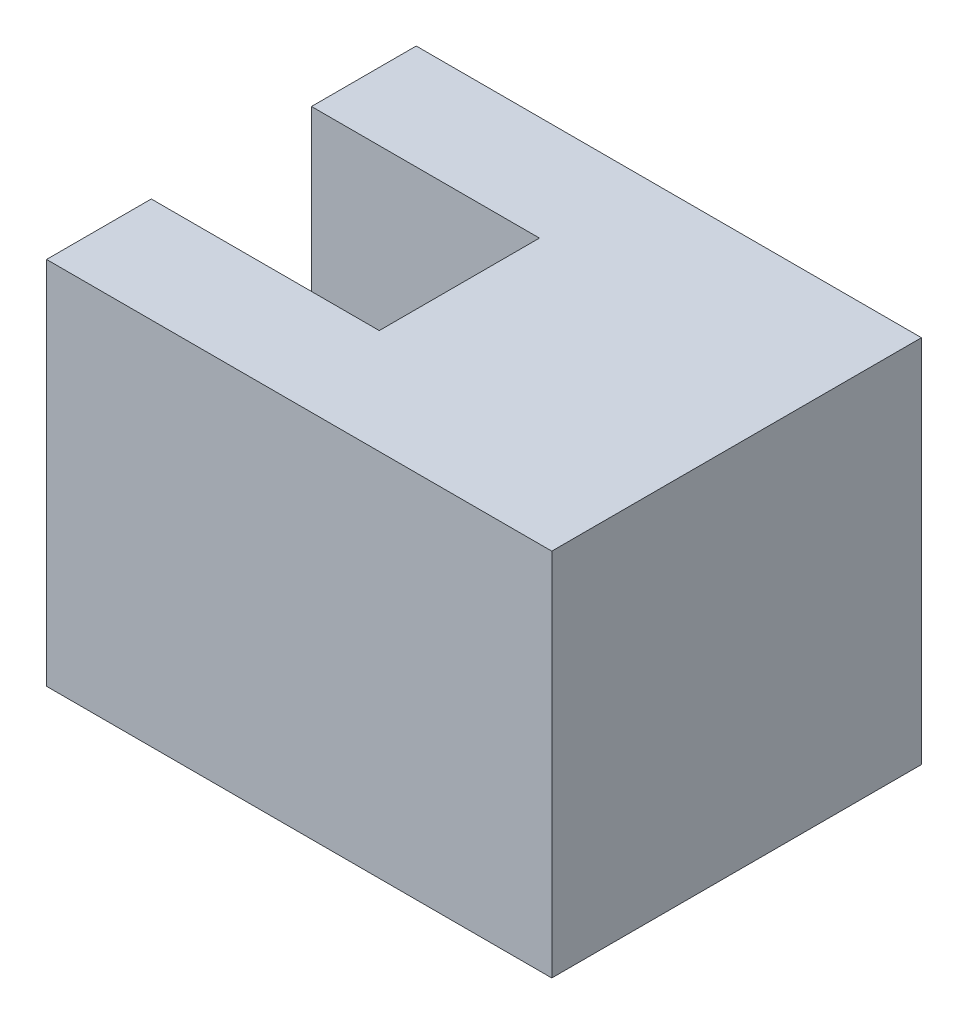
ISO-10303-21;
HEADER;
FILE_DESCRIPTION(('STEP AP214'),'2;1');
FILE_NAME('part.step','',(''),(''),'','','');
FILE_SCHEMA(('AUTOMOTIVE_DESIGN { 1 0 10303 214 1 1 1 1 }'));
ENDSEC;
DATA;
#1=APPLICATION_CONTEXT('core data for automotive mechanical design processes');
#2=APPLICATION_PROTOCOL_DEFINITION('international standard','automotive_design',2000,#1);
#3=PRODUCT_CONTEXT('',#1,'mechanical');
#4=PRODUCT('Part','Part','',(#3));
#5=PRODUCT_RELATED_PRODUCT_CATEGORY('part','',(#4));
#6=PRODUCT_DEFINITION_FORMATION('','',#4);
#7=PRODUCT_DEFINITION_CONTEXT('part definition',#1,'design');
#8=PRODUCT_DEFINITION('design','',#6,#7);
#9=PRODUCT_DEFINITION_SHAPE('','',#8);
#10=(LENGTH_UNIT() NAMED_UNIT(*) SI_UNIT(.MILLI.,.METRE.));
#11=(NAMED_UNIT(*) PLANE_ANGLE_UNIT() SI_UNIT($,.RADIAN.));
#12=(NAMED_UNIT(*) SI_UNIT($,.STERADIAN.) SOLID_ANGLE_UNIT());
#13=UNCERTAINTY_MEASURE_WITH_UNIT(LENGTH_MEASURE(1.E-05),#10,'distance_accuracy_value','');
#14=(GEOMETRIC_REPRESENTATION_CONTEXT(3) GLOBAL_UNCERTAINTY_ASSIGNED_CONTEXT((#13)) GLOBAL_UNIT_ASSIGNED_CONTEXT((#10,
#11,#12)) REPRESENTATION_CONTEXT('',''));
#15=CARTESIAN_POINT('',(0.,0.,0.));
#16=DIRECTION('',(0.,0.,1.));
#17=DIRECTION('',(1.,0.,0.));
#18=AXIS2_PLACEMENT_3D('',#15,#16,#17);
#19=CARTESIAN_POINT('',(0.,3.,-0.85));
#20=DIRECTION('',(1.,0.,0.));
#21=DIRECTION('',(0.,0.,-1.));
#22=AXIS2_PLACEMENT_3D('',#19,#20,#21);
#23=PLANE('',#22);
#24=DIRECTION('',(0.,0.,1.));
#25=VECTOR('',#24,1.);
#26=CARTESIAN_POINT('',(0.,0.,-0.85));
#27=LINE('',#26,#25);
#28=CARTESIAN_POINT('',(0.,0.,-0.85));
#29=VERTEX_POINT('',#28);
#30=CARTESIAN_POINT('',(0.,0.,0.));
#31=VERTEX_POINT('',#30);
#32=EDGE_CURVE('E140',#29,#31,#27,.T.);
#33=ORIENTED_EDGE('',*,*,#32,.T.);
#34=DIRECTION('',(0.,-1.,0.));
#35=VECTOR('',#34,1.);
#36=CARTESIAN_POINT('',(0.,3.,0.));
#37=LINE('',#36,#35);
#38=CARTESIAN_POINT('',(0.,3.,0.));
#39=VERTEX_POINT('',#38);
#40=EDGE_CURVE('E11',#39,#31,#37,.T.);
#41=ORIENTED_EDGE('',*,*,#40,.F.);
#42=DIRECTION('',(0.,0.,1.));
#43=VECTOR('',#42,1.);
#44=CARTESIAN_POINT('',(0.,3.,-0.85));
#45=LINE('',#44,#43);
#46=CARTESIAN_POINT('',(0.,3.,-0.85));
#47=VERTEX_POINT('',#46);
#48=EDGE_CURVE('E162',#47,#39,#45,.T.);
#49=ORIENTED_EDGE('',*,*,#48,.F.);
#50=DIRECTION('',(0.,-1.,0.));
#51=VECTOR('',#50,1.);
#52=CARTESIAN_POINT('',(0.,3.,-0.85));
#53=LINE('',#52,#51);
#54=EDGE_CURVE('E136',#47,#29,#53,.T.);
#55=ORIENTED_EDGE('',*,*,#54,.T.);
#56=EDGE_LOOP('',(#33,#41,#49,#55));
#57=FACE_BOUND('',#56,.T.);
#58=ADVANCED_FACE('F39',(#57),#23,.F.);
#59=CARTESIAN_POINT('',(0.,3.,0.));
#60=DIRECTION('',(0.,0.,-1.));
#61=DIRECTION('',(-1.,0.,0.));
#62=AXIS2_PLACEMENT_3D('',#59,#60,#61);
#63=PLANE('',#62);
#64=DIRECTION('',(1.,0.,0.));
#65=VECTOR('',#64,1.);
#66=CARTESIAN_POINT('',(0.,0.,0.));
#67=LINE('',#66,#65);
#68=CARTESIAN_POINT('',(4.1,0.,0.));
#69=VERTEX_POINT('',#68);
#70=EDGE_CURVE('E144',#31,#69,#67,.T.);
#71=ORIENTED_EDGE('',*,*,#70,.T.);
#72=DIRECTION('',(0.,-1.,0.));
#73=VECTOR('',#72,1.);
#74=CARTESIAN_POINT('',(4.1,3.,0.));
#75=LINE('',#74,#73);
#76=CARTESIAN_POINT('',(4.1,3.,0.));
#77=VERTEX_POINT('',#76);
#78=EDGE_CURVE('E48',#77,#69,#75,.T.);
#79=ORIENTED_EDGE('',*,*,#78,.F.);
#80=DIRECTION('',(1.,0.,0.));
#81=VECTOR('',#80,1.);
#82=CARTESIAN_POINT('',(0.,3.,0.));
#83=LINE('',#82,#81);
#84=EDGE_CURVE('E99',#39,#77,#83,.T.);
#85=ORIENTED_EDGE('',*,*,#84,.F.);
#86=ORIENTED_EDGE('',*,*,#40,.T.);
#87=EDGE_LOOP('',(#71,#79,#85,#86));
#88=FACE_BOUND('',#87,.T.);
#89=ADVANCED_FACE('F208',(#88),#63,.F.);
#90=CARTESIAN_POINT('',(4.1,3.,0.));
#91=DIRECTION('',(-1.,0.,0.));
#92=DIRECTION('',(0.,0.,1.));
#93=AXIS2_PLACEMENT_3D('',#90,#91,#92);
#94=PLANE('',#93);
#95=DIRECTION('',(0.,0.,-1.));
#96=VECTOR('',#95,1.);
#97=CARTESIAN_POINT('',(4.1,0.,0.));
#98=LINE('',#97,#96);
#99=CARTESIAN_POINT('',(4.1,0.,-3.));
#100=VERTEX_POINT('',#99);
#101=EDGE_CURVE('E147',#69,#100,#98,.T.);
#102=ORIENTED_EDGE('',*,*,#101,.T.);
#103=DIRECTION('',(0.,-1.,0.));
#104=VECTOR('',#103,1.);
#105=CARTESIAN_POINT('',(4.1,3.,-3.));
#106=LINE('',#105,#104);
#107=CARTESIAN_POINT('',(4.1,3.,-3.));
#108=VERTEX_POINT('',#107);
#109=EDGE_CURVE('E173',#108,#100,#106,.T.);
#110=ORIENTED_EDGE('',*,*,#109,.F.);
#111=DIRECTION('',(0.,0.,-1.));
#112=VECTOR('',#111,1.);
#113=CARTESIAN_POINT('',(4.1,3.,0.));
#114=LINE('',#113,#112);
#115=EDGE_CURVE('E183',#77,#108,#114,.T.);
#116=ORIENTED_EDGE('',*,*,#115,.F.);
#117=ORIENTED_EDGE('',*,*,#78,.T.);
#118=EDGE_LOOP('',(#102,#110,#116,#117));
#119=FACE_BOUND('',#118,.T.);
#120=ADVANCED_FACE('F181',(#119),#94,.F.);
#121=CARTESIAN_POINT('',(4.1,3.,-3.));
#122=DIRECTION('',(0.,0.,1.));
#123=DIRECTION('',(1.,0.,0.));
#124=AXIS2_PLACEMENT_3D('',#121,#122,#123);
#125=PLANE('',#124);
#126=DIRECTION('',(-1.,0.,0.));
#127=VECTOR('',#126,1.);
#128=CARTESIAN_POINT('',(4.1,0.,-3.));
#129=LINE('',#128,#127);
#130=CARTESIAN_POINT('',(0.,0.,-3.));
#131=VERTEX_POINT('',#130);
#132=EDGE_CURVE('E150',#100,#131,#129,.T.);
#133=ORIENTED_EDGE('',*,*,#132,.T.);
#134=DIRECTION('',(0.,-1.,0.));
#135=VECTOR('',#134,1.);
#136=CARTESIAN_POINT('',(0.,3.,-3.));
#137=LINE('',#136,#135);
#138=CARTESIAN_POINT('',(0.,3.,-3.));
#139=VERTEX_POINT('',#138);
#140=EDGE_CURVE('E169',#139,#131,#137,.T.);
#141=ORIENTED_EDGE('',*,*,#140,.F.);
#142=DIRECTION('',(-1.,0.,0.));
#143=VECTOR('',#142,1.);
#144=CARTESIAN_POINT('',(4.1,3.,-3.));
#145=LINE('',#144,#143);
#146=EDGE_CURVE('E196',#108,#139,#145,.T.);
#147=ORIENTED_EDGE('',*,*,#146,.F.);
#148=ORIENTED_EDGE('',*,*,#109,.T.);
#149=EDGE_LOOP('',(#133,#141,#147,#148));
#150=FACE_BOUND('',#149,.T.);
#151=ADVANCED_FACE('F191',(#150),#125,.F.);
#152=CARTESIAN_POINT('',(0.,3.,-3.));
#153=DIRECTION('',(1.,0.,0.));
#154=DIRECTION('',(0.,0.,-1.));
#155=AXIS2_PLACEMENT_3D('',#152,#153,#154);
#156=PLANE('',#155);
#157=DIRECTION('',(0.,0.,1.));
#158=VECTOR('',#157,1.);
#159=CARTESIAN_POINT('',(0.,0.,-3.));
#160=LINE('',#159,#158);
#161=CARTESIAN_POINT('',(0.,0.,-2.15));
#162=VERTEX_POINT('',#161);
#163=EDGE_CURVE('E153',#131,#162,#160,.T.);
#164=ORIENTED_EDGE('',*,*,#163,.T.);
#165=DIRECTION('',(0.,-1.,0.));
#166=VECTOR('',#165,1.);
#167=CARTESIAN_POINT('',(0.,3.,-2.15));
#168=LINE('',#167,#166);
#169=CARTESIAN_POINT('',(0.,3.,-2.15));
#170=VERTEX_POINT('',#169);
#171=EDGE_CURVE('E129',#170,#162,#168,.T.);
#172=ORIENTED_EDGE('',*,*,#171,.F.);
#173=DIRECTION('',(0.,0.,1.));
#174=VECTOR('',#173,1.);
#175=CARTESIAN_POINT('',(0.,3.,-3.));
#176=LINE('',#175,#174);
#177=EDGE_CURVE('E118',#139,#170,#176,.T.);
#178=ORIENTED_EDGE('',*,*,#177,.F.);
#179=ORIENTED_EDGE('',*,*,#140,.T.);
#180=EDGE_LOOP('',(#164,#172,#178,#179));
#181=FACE_BOUND('',#180,.T.);
#182=ADVANCED_FACE('F194',(#181),#156,.F.);
#183=CARTESIAN_POINT('',(0.,3.,-2.15));
#184=DIRECTION('',(0.,0.,-1.));
#185=DIRECTION('',(-1.,0.,0.));
#186=AXIS2_PLACEMENT_3D('',#183,#184,#185);
#187=PLANE('',#186);
#188=DIRECTION('',(1.,0.,0.));
#189=VECTOR('',#188,1.);
#190=CARTESIAN_POINT('',(0.,0.,-2.15));
#191=LINE('',#190,#189);
#192=CARTESIAN_POINT('',(1.85,0.,-2.15));
#193=VERTEX_POINT('',#192);
#194=EDGE_CURVE('E127',#162,#193,#191,.T.);
#195=ORIENTED_EDGE('',*,*,#194,.T.);
#196=DIRECTION('',(0.,-1.,0.));
#197=VECTOR('',#196,1.);
#198=CARTESIAN_POINT('',(1.85,3.,-2.15));
#199=LINE('',#198,#197);
#200=CARTESIAN_POINT('',(1.85,3.,-2.15));
#201=VERTEX_POINT('',#200);
#202=EDGE_CURVE('E124',#201,#193,#199,.T.);
#203=ORIENTED_EDGE('',*,*,#202,.F.);
#204=DIRECTION('',(1.,0.,0.));
#205=VECTOR('',#204,1.);
#206=CARTESIAN_POINT('',(0.,3.,-2.15));
#207=LINE('',#206,#205);
#208=EDGE_CURVE('E112',#170,#201,#207,.T.);
#209=ORIENTED_EDGE('',*,*,#208,.F.);
#210=ORIENTED_EDGE('',*,*,#171,.T.);
#211=EDGE_LOOP('',(#195,#203,#209,#210));
#212=FACE_BOUND('',#211,.T.);
#213=ADVANCED_FACE('F125',(#212),#187,.F.);
#214=CARTESIAN_POINT('',(1.85,3.,-2.15));
#215=DIRECTION('',(1.,0.,0.));
#216=DIRECTION('',(0.,0.,-1.));
#217=AXIS2_PLACEMENT_3D('',#214,#215,#216);
#218=PLANE('',#217);
#219=DIRECTION('',(0.,0.,1.));
#220=VECTOR('',#219,1.);
#221=CARTESIAN_POINT('',(1.85,0.,-2.15));
#222=LINE('',#221,#220);
#223=CARTESIAN_POINT('',(1.85,0.,-0.85));
#224=VERTEX_POINT('',#223);
#225=EDGE_CURVE('E85',#193,#224,#222,.T.);
#226=ORIENTED_EDGE('',*,*,#225,.T.);
#227=DIRECTION('',(0.,-1.,0.));
#228=VECTOR('',#227,1.);
#229=CARTESIAN_POINT('',(1.85,3.,-0.85));
#230=LINE('',#229,#228);
#231=CARTESIAN_POINT('',(1.85,3.,-0.85));
#232=VERTEX_POINT('',#231);
#233=EDGE_CURVE('E130',#232,#224,#230,.T.);
#234=ORIENTED_EDGE('',*,*,#233,.F.);
#235=DIRECTION('',(0.,0.,1.));
#236=VECTOR('',#235,1.);
#237=CARTESIAN_POINT('',(1.85,3.,-2.15));
#238=LINE('',#237,#236);
#239=EDGE_CURVE('E116',#201,#232,#238,.T.);
#240=ORIENTED_EDGE('',*,*,#239,.F.);
#241=ORIENTED_EDGE('',*,*,#202,.T.);
#242=EDGE_LOOP('',(#226,#234,#240,#241));
#243=FACE_BOUND('',#242,.T.);
#244=ADVANCED_FACE('F132',(#243),#218,.F.);
#245=CARTESIAN_POINT('',(1.85,3.,-0.85));
#246=DIRECTION('',(0.,0.,1.));
#247=DIRECTION('',(1.,0.,0.));
#248=AXIS2_PLACEMENT_3D('',#245,#246,#247);
#249=PLANE('',#248);
#250=DIRECTION('',(-1.,0.,0.));
#251=VECTOR('',#250,1.);
#252=CARTESIAN_POINT('',(1.85,0.,-0.85));
#253=LINE('',#252,#251);
#254=EDGE_CURVE('E91',#224,#29,#253,.T.);
#255=ORIENTED_EDGE('',*,*,#254,.T.);
#256=ORIENTED_EDGE('',*,*,#54,.F.);
#257=DIRECTION('',(-1.,0.,0.));
#258=VECTOR('',#257,1.);
#259=CARTESIAN_POINT('',(1.85,3.,-0.85));
#260=LINE('',#259,#258);
#261=EDGE_CURVE('E56',#232,#47,#260,.T.);
#262=ORIENTED_EDGE('',*,*,#261,.F.);
#263=ORIENTED_EDGE('',*,*,#233,.T.);
#264=EDGE_LOOP('',(#255,#256,#262,#263));
#265=FACE_BOUND('',#264,.T.);
#266=ADVANCED_FACE('F224',(#265),#249,.F.);
#267=CARTESIAN_POINT('',(0.,3.,0.));
#268=DIRECTION('',(0.,1.,0.));
#269=DIRECTION('',(0.,0.,1.));
#270=AXIS2_PLACEMENT_3D('',#267,#268,#269);
#271=PLANE('',#270);
#272=ORIENTED_EDGE('',*,*,#48,.T.);
#273=ORIENTED_EDGE('',*,*,#84,.T.);
#274=ORIENTED_EDGE('',*,*,#115,.T.);
#275=ORIENTED_EDGE('',*,*,#146,.T.);
#276=ORIENTED_EDGE('',*,*,#177,.T.);
#277=ORIENTED_EDGE('',*,*,#208,.T.);
#278=ORIENTED_EDGE('',*,*,#239,.T.);
#279=ORIENTED_EDGE('',*,*,#261,.T.);
#280=EDGE_LOOP('',(#272,#273,#274,#275,#276,#277,#278,#279));
#281=FACE_BOUND('',#280,.T.);
#282=ADVANCED_FACE('F114',(#281),#271,.T.);
#283=CARTESIAN_POINT('',(0.,0.,0.));
#284=DIRECTION('',(0.,1.,0.));
#285=DIRECTION('',(0.,0.,1.));
#286=AXIS2_PLACEMENT_3D('',#283,#284,#285);
#287=PLANE('',#286);
#288=ORIENTED_EDGE('',*,*,#32,.F.);
#289=ORIENTED_EDGE('',*,*,#254,.F.);
#290=ORIENTED_EDGE('',*,*,#225,.F.);
#291=ORIENTED_EDGE('',*,*,#194,.F.);
#292=ORIENTED_EDGE('',*,*,#163,.F.);
#293=ORIENTED_EDGE('',*,*,#132,.F.);
#294=ORIENTED_EDGE('',*,*,#101,.F.);
#295=ORIENTED_EDGE('',*,*,#70,.F.);
#296=EDGE_LOOP('',(#288,#289,#290,#291,#292,#293,#294,#295));
#297=FACE_BOUND('',#296,.T.);
#298=ADVANCED_FACE('F187',(#297),#287,.F.);
#299=CLOSED_SHELL('',(#58,#89,#120,#151,#182,#213,#244,#266,#282,#298));
#300=MANIFOLD_SOLID_BREP('B2',#299);
#301=ADVANCED_BREP_SHAPE_REPRESENTATION('',(#18,#300),#14);
#302=SHAPE_DEFINITION_REPRESENTATION(#9,#301);
ENDSEC;
END-ISO-10303-21;
